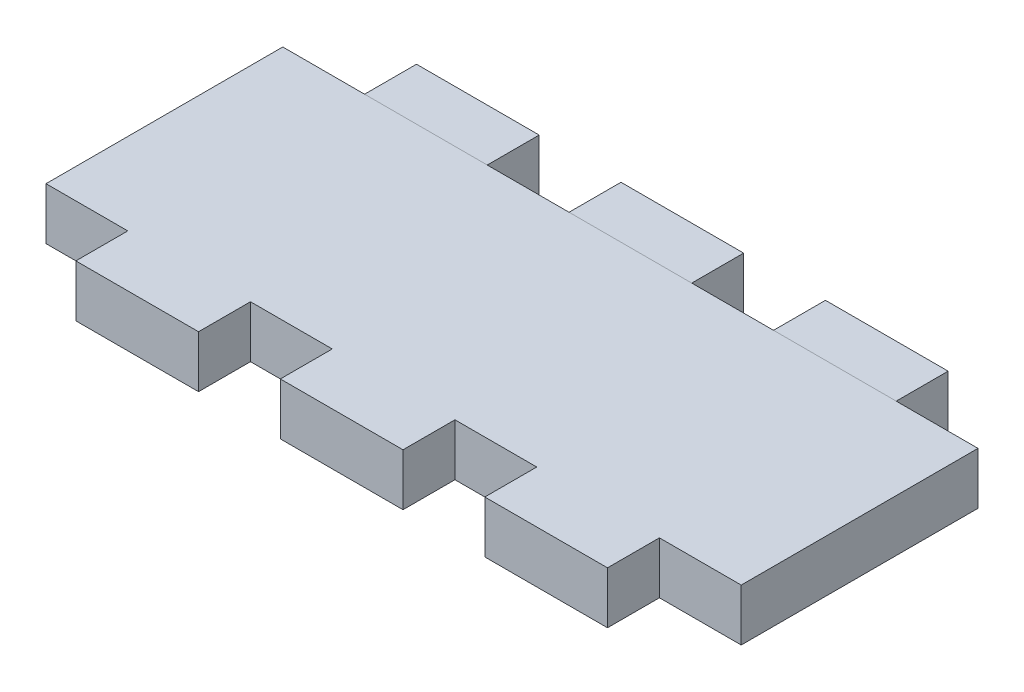
ISO-10303-21;
HEADER;
FILE_DESCRIPTION(('STEP AP214'),'2;1');
FILE_NAME('part.step','',(''),(''),'','','');
FILE_SCHEMA(('AUTOMOTIVE_DESIGN { 1 0 10303 214 1 1 1 1 }'));
ENDSEC;
DATA;
#1=APPLICATION_CONTEXT('core data for automotive mechanical design processes');
#2=APPLICATION_PROTOCOL_DEFINITION('international standard','automotive_design',2000,#1);
#3=PRODUCT_CONTEXT('',#1,'mechanical');
#4=PRODUCT('Part','Part','',(#3));
#5=PRODUCT_RELATED_PRODUCT_CATEGORY('part','',(#4));
#6=PRODUCT_DEFINITION_FORMATION('','',#4);
#7=PRODUCT_DEFINITION_CONTEXT('part definition',#1,'design');
#8=PRODUCT_DEFINITION('design','',#6,#7);
#9=PRODUCT_DEFINITION_SHAPE('','',#8);
#10=(LENGTH_UNIT() NAMED_UNIT(*) SI_UNIT(.MILLI.,.METRE.));
#11=(NAMED_UNIT(*) PLANE_ANGLE_UNIT() SI_UNIT($,.RADIAN.));
#12=(NAMED_UNIT(*) SI_UNIT($,.STERADIAN.) SOLID_ANGLE_UNIT());
#13=UNCERTAINTY_MEASURE_WITH_UNIT(LENGTH_MEASURE(1.E-05),#10,'distance_accuracy_value','');
#14=(GEOMETRIC_REPRESENTATION_CONTEXT(3) GLOBAL_UNCERTAINTY_ASSIGNED_CONTEXT((#13)) GLOBAL_UNIT_ASSIGNED_CONTEXT((#10,
#11,#12)) REPRESENTATION_CONTEXT('',''));
#15=CARTESIAN_POINT('',(0.,0.,0.));
#16=DIRECTION('',(0.,0.,1.));
#17=DIRECTION('',(1.,0.,0.));
#18=AXIS2_PLACEMENT_3D('',#15,#16,#17);
#19=CARTESIAN_POINT('',(17.5,0.,-14.475));
#20=DIRECTION('',(-1.,0.,0.));
#21=DIRECTION('',(0.,0.,1.));
#22=AXIS2_PLACEMENT_3D('',#19,#20,#21);
#23=PLANE('',#22);
#24=DIRECTION('',(0.,0.,1.));
#25=VECTOR('',#24,1.);
#26=CARTESIAN_POINT('',(17.5,6.35,-14.475));
#27=LINE('',#26,#25);
#28=CARTESIAN_POINT('',(17.5,6.35,-20.825));
#29=VERTEX_POINT('',#28);
#30=CARTESIAN_POINT('',(17.5,6.35,-14.475));
#31=VERTEX_POINT('',#30);
#32=EDGE_CURVE('E113',#29,#31,#27,.T.);
#33=ORIENTED_EDGE('',*,*,#32,.F.);
#34=DIRECTION('',(0.,1.,0.));
#35=VECTOR('',#34,1.);
#36=CARTESIAN_POINT('',(17.5,0.,-20.825));
#37=LINE('',#36,#35);
#38=CARTESIAN_POINT('',(17.5,0.,-20.825));
#39=VERTEX_POINT('',#38);
#40=EDGE_CURVE('E12',#39,#29,#37,.T.);
#41=ORIENTED_EDGE('',*,*,#40,.F.);
#42=DIRECTION('',(0.,0.,1.));
#43=VECTOR('',#42,1.);
#44=CARTESIAN_POINT('',(17.5,0.,-14.475));
#45=LINE('',#44,#43);
#46=CARTESIAN_POINT('',(17.5,0.,-14.475));
#47=VERTEX_POINT('',#46);
#48=EDGE_CURVE('E107',#39,#47,#45,.T.);
#49=ORIENTED_EDGE('',*,*,#48,.T.);
#50=DIRECTION('',(0.,1.,0.));
#51=VECTOR('',#50,1.);
#52=CARTESIAN_POINT('',(17.5,0.,-14.475));
#53=LINE('',#52,#51);
#54=EDGE_CURVE('E52',#47,#31,#53,.T.);
#55=ORIENTED_EDGE('',*,*,#54,.T.);
#56=EDGE_LOOP('',(#33,#41,#49,#55));
#57=FACE_BOUND('',#56,.T.);
#58=ADVANCED_FACE('F49',(#57),#23,.T.);
#59=CARTESIAN_POINT('',(17.5,0.,-20.825));
#60=DIRECTION('',(0.,0.,-1.));
#61=DIRECTION('',(-1.,0.,0.));
#62=AXIS2_PLACEMENT_3D('',#59,#60,#61);
#63=PLANE('',#62);
#64=DIRECTION('',(-1.,0.,0.));
#65=VECTOR('',#64,1.);
#66=CARTESIAN_POINT('',(17.5,6.35,-20.825));
#67=LINE('',#66,#65);
#68=CARTESIAN_POINT('',(32.5,6.35,-20.825));
#69=VERTEX_POINT('',#68);
#70=EDGE_CURVE('E109',#69,#29,#67,.T.);
#71=ORIENTED_EDGE('',*,*,#70,.F.);
#72=DIRECTION('',(0.,1.,0.));
#73=VECTOR('',#72,1.);
#74=CARTESIAN_POINT('',(32.5,0.,-20.825));
#75=LINE('',#74,#73);
#76=CARTESIAN_POINT('',(32.5,0.,-20.825));
#77=VERTEX_POINT('',#76);
#78=EDGE_CURVE('E58',#77,#69,#75,.T.);
#79=ORIENTED_EDGE('',*,*,#78,.F.);
#80=DIRECTION('',(-1.,0.,0.));
#81=VECTOR('',#80,1.);
#82=CARTESIAN_POINT('',(17.5,0.,-20.825));
#83=LINE('',#82,#81);
#84=EDGE_CURVE('E104',#77,#39,#83,.T.);
#85=ORIENTED_EDGE('',*,*,#84,.T.);
#86=ORIENTED_EDGE('',*,*,#40,.T.);
#87=EDGE_LOOP('',(#71,#79,#85,#86));
#88=FACE_BOUND('',#87,.T.);
#89=ADVANCED_FACE('F123',(#88),#63,.T.);
#90=CARTESIAN_POINT('',(32.5,0.,-14.475));
#91=DIRECTION('',(1.,0.,0.));
#92=DIRECTION('',(0.,0.,-1.));
#93=AXIS2_PLACEMENT_3D('',#90,#91,#92);
#94=PLANE('',#93);
#95=DIRECTION('',(0.,0.,-1.));
#96=VECTOR('',#95,1.);
#97=CARTESIAN_POINT('',(32.5,6.35,-14.475));
#98=LINE('',#97,#96);
#99=CARTESIAN_POINT('',(32.5,6.35,-14.475));
#100=VERTEX_POINT('',#99);
#101=EDGE_CURVE('E99',#100,#69,#98,.T.);
#102=ORIENTED_EDGE('',*,*,#101,.F.);
#103=DIRECTION('',(0.,1.,0.));
#104=VECTOR('',#103,1.);
#105=CARTESIAN_POINT('',(32.5,0.,-14.475));
#106=LINE('',#105,#104);
#107=CARTESIAN_POINT('',(32.5,0.,-14.475));
#108=VERTEX_POINT('',#107);
#109=EDGE_CURVE('E94',#108,#100,#106,.T.);
#110=ORIENTED_EDGE('',*,*,#109,.F.);
#111=DIRECTION('',(0.,0.,-1.));
#112=VECTOR('',#111,1.);
#113=CARTESIAN_POINT('',(32.5,0.,-14.475));
#114=LINE('',#113,#112);
#115=EDGE_CURVE('E97',#108,#77,#114,.T.);
#116=ORIENTED_EDGE('',*,*,#115,.T.);
#117=ORIENTED_EDGE('',*,*,#78,.T.);
#118=EDGE_LOOP('',(#102,#110,#116,#117));
#119=FACE_BOUND('',#118,.T.);
#120=ADVANCED_FACE('F96',(#119),#94,.T.);
#121=CARTESIAN_POINT('',(17.5,0.,-14.475));
#122=DIRECTION('',(0.,0.,1.));
#123=DIRECTION('',(1.,0.,0.));
#124=AXIS2_PLACEMENT_3D('',#121,#122,#123);
#125=PLANE('',#124);
#126=DIRECTION('',(1.,0.,0.));
#127=VECTOR('',#126,1.);
#128=CARTESIAN_POINT('',(17.5,6.35,-14.475));
#129=LINE('',#128,#127);
#130=EDGE_CURVE('E116',#31,#100,#129,.T.);
#131=ORIENTED_EDGE('',*,*,#130,.F.);
#132=ORIENTED_EDGE('',*,*,#54,.F.);
#133=DIRECTION('',(1.,0.,0.));
#134=VECTOR('',#133,1.);
#135=CARTESIAN_POINT('',(17.5,0.,-14.475));
#136=LINE('',#135,#134);
#137=EDGE_CURVE('E103',#47,#108,#136,.T.);
#138=ORIENTED_EDGE('',*,*,#137,.T.);
#139=ORIENTED_EDGE('',*,*,#109,.T.);
#140=EDGE_LOOP('',(#131,#132,#138,#139));
#141=FACE_BOUND('',#140,.T.);
#142=ADVANCED_FACE('F106',(#141),#125,.T.);
#143=CARTESIAN_POINT('',(0.,0.,0.));
#144=DIRECTION('',(0.,-1.,0.));
#145=DIRECTION('',(0.,0.,-1.));
#146=AXIS2_PLACEMENT_3D('',#143,#144,#145);
#147=PLANE('',#146);
#148=ORIENTED_EDGE('',*,*,#48,.F.);
#149=ORIENTED_EDGE('',*,*,#84,.F.);
#150=ORIENTED_EDGE('',*,*,#115,.F.);
#151=ORIENTED_EDGE('',*,*,#137,.F.);
#152=EDGE_LOOP('',(#148,#149,#150,#151));
#153=FACE_BOUND('',#152,.T.);
#154=ADVANCED_FACE('F102',(#153),#147,.T.);
#155=CARTESIAN_POINT('',(0.,6.35,0.));
#156=DIRECTION('',(0.,-1.,0.));
#157=DIRECTION('',(0.,0.,-1.));
#158=AXIS2_PLACEMENT_3D('',#155,#156,#157);
#159=PLANE('',#158);
#160=ORIENTED_EDGE('',*,*,#32,.T.);
#161=ORIENTED_EDGE('',*,*,#130,.T.);
#162=ORIENTED_EDGE('',*,*,#101,.T.);
#163=ORIENTED_EDGE('',*,*,#70,.T.);
#164=EDGE_LOOP('',(#160,#161,#162,#163));
#165=FACE_BOUND('',#164,.T.);
#166=ADVANCED_FACE('F122',(#165),#159,.F.);
#167=CLOSED_SHELL('',(#58,#89,#120,#142,#154,#166));
#168=MANIFOLD_SOLID_BREP('B2',#167);
#169=CARTESIAN_POINT('',(-7.5,0.,-14.475));
#170=DIRECTION('',(-1.,0.,0.));
#171=DIRECTION('',(0.,0.,1.));
#172=AXIS2_PLACEMENT_3D('',#169,#170,#171);
#173=PLANE('',#172);
#174=DIRECTION('',(0.,0.,1.));
#175=VECTOR('',#174,1.);
#176=CARTESIAN_POINT('',(-7.5,6.35,-14.475));
#177=LINE('',#176,#175);
#178=CARTESIAN_POINT('',(-7.5,6.35,-20.825));
#179=VERTEX_POINT('',#178);
#180=CARTESIAN_POINT('',(-7.5,6.35,-14.475));
#181=VERTEX_POINT('',#180);
#182=EDGE_CURVE('E246',#179,#181,#177,.T.);
#183=ORIENTED_EDGE('',*,*,#182,.F.);
#184=DIRECTION('',(0.,1.,0.));
#185=VECTOR('',#184,1.);
#186=CARTESIAN_POINT('',(-7.5,0.,-20.825));
#187=LINE('',#186,#185);
#188=CARTESIAN_POINT('',(-7.5,0.,-20.825));
#189=VERTEX_POINT('',#188);
#190=EDGE_CURVE('E47',#189,#179,#187,.T.);
#191=ORIENTED_EDGE('',*,*,#190,.F.);
#192=DIRECTION('',(0.,0.,1.));
#193=VECTOR('',#192,1.);
#194=CARTESIAN_POINT('',(-7.5,0.,-14.475));
#195=LINE('',#194,#193);
#196=CARTESIAN_POINT('',(-7.5,0.,-14.475));
#197=VERTEX_POINT('',#196);
#198=EDGE_CURVE('E240',#189,#197,#195,.T.);
#199=ORIENTED_EDGE('',*,*,#198,.T.);
#200=DIRECTION('',(0.,1.,0.));
#201=VECTOR('',#200,1.);
#202=CARTESIAN_POINT('',(-7.5,0.,-14.475));
#203=LINE('',#202,#201);
#204=EDGE_CURVE('E185',#197,#181,#203,.T.);
#205=ORIENTED_EDGE('',*,*,#204,.T.);
#206=EDGE_LOOP('',(#183,#191,#199,#205));
#207=FACE_BOUND('',#206,.T.);
#208=ADVANCED_FACE('F182',(#207),#173,.T.);
#209=CARTESIAN_POINT('',(-7.5,0.,-20.825));
#210=DIRECTION('',(0.,0.,-1.));
#211=DIRECTION('',(-1.,0.,0.));
#212=AXIS2_PLACEMENT_3D('',#209,#210,#211);
#213=PLANE('',#212);
#214=DIRECTION('',(-1.,0.,0.));
#215=VECTOR('',#214,1.);
#216=CARTESIAN_POINT('',(-7.5,6.35,-20.825));
#217=LINE('',#216,#215);
#218=CARTESIAN_POINT('',(7.5,6.35,-20.825));
#219=VERTEX_POINT('',#218);
#220=EDGE_CURVE('E242',#219,#179,#217,.T.);
#221=ORIENTED_EDGE('',*,*,#220,.F.);
#222=DIRECTION('',(0.,1.,0.));
#223=VECTOR('',#222,1.);
#224=CARTESIAN_POINT('',(7.5,0.,-20.825));
#225=LINE('',#224,#223);
#226=CARTESIAN_POINT('',(7.5,0.,-20.825));
#227=VERTEX_POINT('',#226);
#228=EDGE_CURVE('E191',#227,#219,#225,.T.);
#229=ORIENTED_EDGE('',*,*,#228,.F.);
#230=DIRECTION('',(-1.,0.,0.));
#231=VECTOR('',#230,1.);
#232=CARTESIAN_POINT('',(-7.5,0.,-20.825));
#233=LINE('',#232,#231);
#234=EDGE_CURVE('E237',#227,#189,#233,.T.);
#235=ORIENTED_EDGE('',*,*,#234,.T.);
#236=ORIENTED_EDGE('',*,*,#190,.T.);
#237=EDGE_LOOP('',(#221,#229,#235,#236));
#238=FACE_BOUND('',#237,.T.);
#239=ADVANCED_FACE('F256',(#238),#213,.T.);
#240=CARTESIAN_POINT('',(7.5,0.,-14.475));
#241=DIRECTION('',(1.,0.,0.));
#242=DIRECTION('',(0.,0.,-1.));
#243=AXIS2_PLACEMENT_3D('',#240,#241,#242);
#244=PLANE('',#243);
#245=DIRECTION('',(0.,0.,-1.));
#246=VECTOR('',#245,1.);
#247=CARTESIAN_POINT('',(7.5,6.35,-14.475));
#248=LINE('',#247,#246);
#249=CARTESIAN_POINT('',(7.5,6.35,-14.475));
#250=VERTEX_POINT('',#249);
#251=EDGE_CURVE('E232',#250,#219,#248,.T.);
#252=ORIENTED_EDGE('',*,*,#251,.F.);
#253=DIRECTION('',(0.,1.,0.));
#254=VECTOR('',#253,1.);
#255=CARTESIAN_POINT('',(7.5,0.,-14.475));
#256=LINE('',#255,#254);
#257=CARTESIAN_POINT('',(7.5,0.,-14.475));
#258=VERTEX_POINT('',#257);
#259=EDGE_CURVE('E227',#258,#250,#256,.T.);
#260=ORIENTED_EDGE('',*,*,#259,.F.);
#261=DIRECTION('',(0.,0.,-1.));
#262=VECTOR('',#261,1.);
#263=CARTESIAN_POINT('',(7.5,0.,-14.475));
#264=LINE('',#263,#262);
#265=EDGE_CURVE('E230',#258,#227,#264,.T.);
#266=ORIENTED_EDGE('',*,*,#265,.T.);
#267=ORIENTED_EDGE('',*,*,#228,.T.);
#268=EDGE_LOOP('',(#252,#260,#266,#267));
#269=FACE_BOUND('',#268,.T.);
#270=ADVANCED_FACE('F229',(#269),#244,.T.);
#271=CARTESIAN_POINT('',(-7.5,0.,-14.475));
#272=DIRECTION('',(0.,0.,1.));
#273=DIRECTION('',(1.,0.,0.));
#274=AXIS2_PLACEMENT_3D('',#271,#272,#273);
#275=PLANE('',#274);
#276=DIRECTION('',(1.,0.,0.));
#277=VECTOR('',#276,1.);
#278=CARTESIAN_POINT('',(-7.5,6.35,-14.475));
#279=LINE('',#278,#277);
#280=EDGE_CURVE('E249',#181,#250,#279,.T.);
#281=ORIENTED_EDGE('',*,*,#280,.F.);
#282=ORIENTED_EDGE('',*,*,#204,.F.);
#283=DIRECTION('',(1.,0.,0.));
#284=VECTOR('',#283,1.);
#285=CARTESIAN_POINT('',(-7.5,0.,-14.475));
#286=LINE('',#285,#284);
#287=EDGE_CURVE('E236',#197,#258,#286,.T.);
#288=ORIENTED_EDGE('',*,*,#287,.T.);
#289=ORIENTED_EDGE('',*,*,#259,.T.);
#290=EDGE_LOOP('',(#281,#282,#288,#289));
#291=FACE_BOUND('',#290,.T.);
#292=ADVANCED_FACE('F239',(#291),#275,.T.);
#293=CARTESIAN_POINT('',(0.,0.,0.));
#294=DIRECTION('',(0.,-1.,0.));
#295=DIRECTION('',(0.,0.,-1.));
#296=AXIS2_PLACEMENT_3D('',#293,#294,#295);
#297=PLANE('',#296);
#298=ORIENTED_EDGE('',*,*,#198,.F.);
#299=ORIENTED_EDGE('',*,*,#234,.F.);
#300=ORIENTED_EDGE('',*,*,#265,.F.);
#301=ORIENTED_EDGE('',*,*,#287,.F.);
#302=EDGE_LOOP('',(#298,#299,#300,#301));
#303=FACE_BOUND('',#302,.T.);
#304=ADVANCED_FACE('F235',(#303),#297,.T.);
#305=CARTESIAN_POINT('',(0.,6.35,0.));
#306=DIRECTION('',(0.,-1.,0.));
#307=DIRECTION('',(0.,0.,-1.));
#308=AXIS2_PLACEMENT_3D('',#305,#306,#307);
#309=PLANE('',#308);
#310=ORIENTED_EDGE('',*,*,#182,.T.);
#311=ORIENTED_EDGE('',*,*,#280,.T.);
#312=ORIENTED_EDGE('',*,*,#251,.T.);
#313=ORIENTED_EDGE('',*,*,#220,.T.);
#314=EDGE_LOOP('',(#310,#311,#312,#313));
#315=FACE_BOUND('',#314,.T.);
#316=ADVANCED_FACE('F255',(#315),#309,.F.);
#317=CLOSED_SHELL('',(#208,#239,#270,#292,#304,#316));
#318=MANIFOLD_SOLID_BREP('B6',#317);
#319=CARTESIAN_POINT('',(-32.5,0.,-14.475));
#320=DIRECTION('',(-1.,0.,0.));
#321=DIRECTION('',(0.,0.,1.));
#322=AXIS2_PLACEMENT_3D('',#319,#320,#321);
#323=PLANE('',#322);
#324=DIRECTION('',(0.,0.,1.));
#325=VECTOR('',#324,1.);
#326=CARTESIAN_POINT('',(-32.5,6.35,-14.475));
#327=LINE('',#326,#325);
#328=CARTESIAN_POINT('',(-32.5,6.35,-20.825));
#329=VERTEX_POINT('',#328);
#330=CARTESIAN_POINT('',(-32.5,6.35,-14.475));
#331=VERTEX_POINT('',#330);
#332=EDGE_CURVE('E378',#329,#331,#327,.T.);
#333=ORIENTED_EDGE('',*,*,#332,.F.);
#334=DIRECTION('',(0.,1.,0.));
#335=VECTOR('',#334,1.);
#336=CARTESIAN_POINT('',(-32.5,0.,-20.825));
#337=LINE('',#336,#335);
#338=CARTESIAN_POINT('',(-32.5,0.,-20.825));
#339=VERTEX_POINT('',#338);
#340=EDGE_CURVE('E180',#339,#329,#337,.T.);
#341=ORIENTED_EDGE('',*,*,#340,.F.);
#342=DIRECTION('',(0.,0.,1.));
#343=VECTOR('',#342,1.);
#344=CARTESIAN_POINT('',(-32.5,0.,-14.475));
#345=LINE('',#344,#343);
#346=CARTESIAN_POINT('',(-32.5,0.,-14.475));
#347=VERTEX_POINT('',#346);
#348=EDGE_CURVE('E372',#339,#347,#345,.T.);
#349=ORIENTED_EDGE('',*,*,#348,.T.);
#350=DIRECTION('',(0.,1.,0.));
#351=VECTOR('',#350,1.);
#352=CARTESIAN_POINT('',(-32.5,0.,-14.475));
#353=LINE('',#352,#351);
#354=EDGE_CURVE('E317',#347,#331,#353,.T.);
#355=ORIENTED_EDGE('',*,*,#354,.T.);
#356=EDGE_LOOP('',(#333,#341,#349,#355));
#357=FACE_BOUND('',#356,.T.);
#358=ADVANCED_FACE('F314',(#357),#323,.T.);
#359=CARTESIAN_POINT('',(-32.5,0.,-20.825));
#360=DIRECTION('',(0.,0.,-1.));
#361=DIRECTION('',(-1.,0.,0.));
#362=AXIS2_PLACEMENT_3D('',#359,#360,#361);
#363=PLANE('',#362);
#364=DIRECTION('',(-1.,0.,0.));
#365=VECTOR('',#364,1.);
#366=CARTESIAN_POINT('',(-32.5,6.35,-20.825));
#367=LINE('',#366,#365);
#368=CARTESIAN_POINT('',(-17.5,6.35,-20.825));
#369=VERTEX_POINT('',#368);
#370=EDGE_CURVE('E374',#369,#329,#367,.T.);
#371=ORIENTED_EDGE('',*,*,#370,.F.);
#372=DIRECTION('',(0.,1.,0.));
#373=VECTOR('',#372,1.);
#374=CARTESIAN_POINT('',(-17.5,0.,-20.825));
#375=LINE('',#374,#373);
#376=CARTESIAN_POINT('',(-17.5,0.,-20.825));
#377=VERTEX_POINT('',#376);
#378=EDGE_CURVE('E323',#377,#369,#375,.T.);
#379=ORIENTED_EDGE('',*,*,#378,.F.);
#380=DIRECTION('',(-1.,0.,0.));
#381=VECTOR('',#380,1.);
#382=CARTESIAN_POINT('',(-32.5,0.,-20.825));
#383=LINE('',#382,#381);
#384=EDGE_CURVE('E369',#377,#339,#383,.T.);
#385=ORIENTED_EDGE('',*,*,#384,.T.);
#386=ORIENTED_EDGE('',*,*,#340,.T.);
#387=EDGE_LOOP('',(#371,#379,#385,#386));
#388=FACE_BOUND('',#387,.T.);
#389=ADVANCED_FACE('F388',(#388),#363,.T.);
#390=CARTESIAN_POINT('',(-17.5,0.,-14.475));
#391=DIRECTION('',(1.,0.,0.));
#392=DIRECTION('',(0.,0.,-1.));
#393=AXIS2_PLACEMENT_3D('',#390,#391,#392);
#394=PLANE('',#393);
#395=DIRECTION('',(0.,0.,-1.));
#396=VECTOR('',#395,1.);
#397=CARTESIAN_POINT('',(-17.5,6.35,-14.475));
#398=LINE('',#397,#396);
#399=CARTESIAN_POINT('',(-17.5,6.35,-14.475));
#400=VERTEX_POINT('',#399);
#401=EDGE_CURVE('E364',#400,#369,#398,.T.);
#402=ORIENTED_EDGE('',*,*,#401,.F.);
#403=DIRECTION('',(0.,1.,0.));
#404=VECTOR('',#403,1.);
#405=CARTESIAN_POINT('',(-17.5,0.,-14.475));
#406=LINE('',#405,#404);
#407=CARTESIAN_POINT('',(-17.5,0.,-14.475));
#408=VERTEX_POINT('',#407);
#409=EDGE_CURVE('E359',#408,#400,#406,.T.);
#410=ORIENTED_EDGE('',*,*,#409,.F.);
#411=DIRECTION('',(0.,0.,-1.));
#412=VECTOR('',#411,1.);
#413=CARTESIAN_POINT('',(-17.5,0.,-14.475));
#414=LINE('',#413,#412);
#415=EDGE_CURVE('E362',#408,#377,#414,.T.);
#416=ORIENTED_EDGE('',*,*,#415,.T.);
#417=ORIENTED_EDGE('',*,*,#378,.T.);
#418=EDGE_LOOP('',(#402,#410,#416,#417));
#419=FACE_BOUND('',#418,.T.);
#420=ADVANCED_FACE('F361',(#419),#394,.T.);
#421=CARTESIAN_POINT('',(-32.5,0.,-14.475));
#422=DIRECTION('',(0.,0.,1.));
#423=DIRECTION('',(1.,0.,0.));
#424=AXIS2_PLACEMENT_3D('',#421,#422,#423);
#425=PLANE('',#424);
#426=DIRECTION('',(1.,0.,0.));
#427=VECTOR('',#426,1.);
#428=CARTESIAN_POINT('',(-32.5,6.35,-14.475));
#429=LINE('',#428,#427);
#430=EDGE_CURVE('E381',#331,#400,#429,.T.);
#431=ORIENTED_EDGE('',*,*,#430,.F.);
#432=ORIENTED_EDGE('',*,*,#354,.F.);
#433=DIRECTION('',(1.,0.,0.));
#434=VECTOR('',#433,1.);
#435=CARTESIAN_POINT('',(-32.5,0.,-14.475));
#436=LINE('',#435,#434);
#437=EDGE_CURVE('E368',#347,#408,#436,.T.);
#438=ORIENTED_EDGE('',*,*,#437,.T.);
#439=ORIENTED_EDGE('',*,*,#409,.T.);
#440=EDGE_LOOP('',(#431,#432,#438,#439));
#441=FACE_BOUND('',#440,.T.);
#442=ADVANCED_FACE('F371',(#441),#425,.T.);
#443=CARTESIAN_POINT('',(0.,0.,0.));
#444=DIRECTION('',(0.,-1.,0.));
#445=DIRECTION('',(0.,0.,-1.));
#446=AXIS2_PLACEMENT_3D('',#443,#444,#445);
#447=PLANE('',#446);
#448=ORIENTED_EDGE('',*,*,#348,.F.);
#449=ORIENTED_EDGE('',*,*,#384,.F.);
#450=ORIENTED_EDGE('',*,*,#415,.F.);
#451=ORIENTED_EDGE('',*,*,#437,.F.);
#452=EDGE_LOOP('',(#448,#449,#450,#451));
#453=FACE_BOUND('',#452,.T.);
#454=ADVANCED_FACE('F367',(#453),#447,.T.);
#455=CARTESIAN_POINT('',(0.,6.35,0.));
#456=DIRECTION('',(0.,-1.,0.));
#457=DIRECTION('',(0.,0.,-1.));
#458=AXIS2_PLACEMENT_3D('',#455,#456,#457);
#459=PLANE('',#458);
#460=ORIENTED_EDGE('',*,*,#332,.T.);
#461=ORIENTED_EDGE('',*,*,#430,.T.);
#462=ORIENTED_EDGE('',*,*,#401,.T.);
#463=ORIENTED_EDGE('',*,*,#370,.T.);
#464=EDGE_LOOP('',(#460,#461,#462,#463));
#465=FACE_BOUND('',#464,.T.);
#466=ADVANCED_FACE('F387',(#465),#459,.F.);
#467=CLOSED_SHELL('',(#358,#389,#420,#442,#454,#466));
#468=MANIFOLD_SOLID_BREP('B41',#467);
#469=CARTESIAN_POINT('',(-42.5,6.35,14.475));
#470=DIRECTION('',(0.,0.,-1.));
#471=DIRECTION('',(-1.,0.,0.));
#472=AXIS2_PLACEMENT_3D('',#469,#470,#471);
#473=PLANE('',#472);
#474=DIRECTION('',(1.,0.,0.));
#475=VECTOR('',#474,1.);
#476=CARTESIAN_POINT('',(-42.5,0.,14.475));
#477=LINE('',#476,#475);
#478=CARTESIAN_POINT('',(7.5,0.,14.475));
#479=VERTEX_POINT('',#478);
#480=CARTESIAN_POINT('',(17.5,0.,14.475));
#481=VERTEX_POINT('',#480);
#482=EDGE_CURVE('E730',#479,#481,#477,.T.);
#483=ORIENTED_EDGE('',*,*,#482,.T.);
#484=DIRECTION('',(0.,1.,0.));
#485=VECTOR('',#484,1.);
#486=CARTESIAN_POINT('',(17.5,0.,14.475));
#487=LINE('',#486,#485);
#488=CARTESIAN_POINT('',(17.5,6.35,14.475));
#489=VERTEX_POINT('',#488);
#490=EDGE_CURVE('E461',#481,#489,#487,.T.);
#491=ORIENTED_EDGE('',*,*,#490,.T.);
#492=DIRECTION('',(1.,0.,0.));
#493=VECTOR('',#492,1.);
#494=CARTESIAN_POINT('',(-42.5,6.35,14.475));
#495=LINE('',#494,#493);
#496=CARTESIAN_POINT('',(7.5,6.35,14.475));
#497=VERTEX_POINT('',#496);
#498=EDGE_CURVE('E577',#497,#489,#495,.T.);
#499=ORIENTED_EDGE('',*,*,#498,.F.);
#500=DIRECTION('',(0.,1.,0.));
#501=VECTOR('',#500,1.);
#502=CARTESIAN_POINT('',(7.5,0.,14.475));
#503=LINE('',#502,#501);
#504=EDGE_CURVE('E627',#479,#497,#503,.T.);
#505=ORIENTED_EDGE('',*,*,#504,.F.);
#506=EDGE_LOOP('',(#483,#491,#499,#505));
#507=FACE_BOUND('',#506,.T.);
#508=ADVANCED_FACE('F437',(#507),#473,.F.);
#509=CARTESIAN_POINT('',(-17.5,0.,14.475));
#510=VERTEX_POINT('',#509);
#511=CARTESIAN_POINT('',(-7.5,0.,14.475));
#512=VERTEX_POINT('',#511);
#513=EDGE_CURVE('E697',#510,#512,#477,.T.);
#514=ORIENTED_EDGE('',*,*,#513,.T.);
#515=DIRECTION('',(0.,1.,0.));
#516=VECTOR('',#515,1.);
#517=CARTESIAN_POINT('',(-7.5,0.,14.475));
#518=LINE('',#517,#516);
#519=CARTESIAN_POINT('',(-7.5,6.35,14.475));
#520=VERTEX_POINT('',#519);
#521=EDGE_CURVE('E611',#512,#520,#518,.T.);
#522=ORIENTED_EDGE('',*,*,#521,.T.);
#523=CARTESIAN_POINT('',(-17.5,6.35,14.475));
#524=VERTEX_POINT('',#523);
#525=EDGE_CURVE('E683',#524,#520,#495,.T.);
#526=ORIENTED_EDGE('',*,*,#525,.F.);
#527=DIRECTION('',(0.,1.,0.));
#528=VECTOR('',#527,1.);
#529=CARTESIAN_POINT('',(-17.5,0.,14.475));
#530=LINE('',#529,#528);
#531=EDGE_CURVE('E661',#510,#524,#530,.T.);
#532=ORIENTED_EDGE('',*,*,#531,.F.);
#533=EDGE_LOOP('',(#514,#522,#526,#532));
#534=FACE_BOUND('',#533,.T.);
#535=ADVANCED_FACE('F754',(#534),#473,.F.);
#536=CARTESIAN_POINT('',(32.5,6.35,14.475));
#537=VERTEX_POINT('',#536);
#538=CARTESIAN_POINT('',(42.5,6.35,14.475));
#539=VERTEX_POINT('',#538);
#540=EDGE_CURVE('E453',#537,#539,#495,.T.);
#541=ORIENTED_EDGE('',*,*,#540,.F.);
#542=DIRECTION('',(0.,1.,0.));
#543=VECTOR('',#542,1.);
#544=CARTESIAN_POINT('',(32.5,0.,14.475));
#545=LINE('',#544,#543);
#546=CARTESIAN_POINT('',(32.5,0.,14.475));
#547=VERTEX_POINT('',#546);
#548=EDGE_CURVE('E593',#547,#537,#545,.T.);
#549=ORIENTED_EDGE('',*,*,#548,.F.);
#550=CARTESIAN_POINT('',(42.5,0.,14.475));
#551=VERTEX_POINT('',#550);
#552=EDGE_CURVE('E693',#547,#551,#477,.T.);
#553=ORIENTED_EDGE('',*,*,#552,.T.);
#554=DIRECTION('',(0.,-1.,0.));
#555=VECTOR('',#554,1.);
#556=CARTESIAN_POINT('',(42.5,6.35,14.475));
#557=LINE('',#556,#555);
#558=EDGE_CURVE('E682',#539,#551,#557,.T.);
#559=ORIENTED_EDGE('',*,*,#558,.F.);
#560=EDGE_LOOP('',(#541,#549,#553,#559));
#561=FACE_BOUND('',#560,.T.);
#562=ADVANCED_FACE('F731',(#561),#473,.F.);
#563=CARTESIAN_POINT('',(42.5,6.35,14.475));
#564=DIRECTION('',(-1.,0.,0.));
#565=DIRECTION('',(0.,0.,1.));
#566=AXIS2_PLACEMENT_3D('',#563,#564,#565);
#567=PLANE('',#566);
#568=DIRECTION('',(0.,0.,-1.));
#569=VECTOR('',#568,1.);
#570=CARTESIAN_POINT('',(42.5,0.,14.475));
#571=LINE('',#570,#569);
#572=CARTESIAN_POINT('',(42.5,0.,-14.475));
#573=VERTEX_POINT('',#572);
#574=EDGE_CURVE('E667',#551,#573,#571,.T.);
#575=ORIENTED_EDGE('',*,*,#574,.T.);
#576=DIRECTION('',(0.,-1.,0.));
#577=VECTOR('',#576,1.);
#578=CARTESIAN_POINT('',(42.5,6.35,-14.475));
#579=LINE('',#578,#577);
#580=CARTESIAN_POINT('',(42.5,6.35,-14.475));
#581=VERTEX_POINT('',#580);
#582=EDGE_CURVE('E312',#581,#573,#579,.T.);
#583=ORIENTED_EDGE('',*,*,#582,.F.);
#584=DIRECTION('',(0.,0.,-1.));
#585=VECTOR('',#584,1.);
#586=CARTESIAN_POINT('',(42.5,6.35,14.475));
#587=LINE('',#586,#585);
#588=EDGE_CURVE('E668',#539,#581,#587,.T.);
#589=ORIENTED_EDGE('',*,*,#588,.F.);
#590=ORIENTED_EDGE('',*,*,#558,.T.);
#591=EDGE_LOOP('',(#575,#583,#589,#590));
#592=FACE_BOUND('',#591,.T.);
#593=ADVANCED_FACE('F439',(#592),#567,.F.);
#594=CARTESIAN_POINT('',(-42.5,6.35,-14.475));
#595=DIRECTION('',(0.,0.,1.));
#596=DIRECTION('',(1.,0.,0.));
#597=AXIS2_PLACEMENT_3D('',#594,#595,#596);
#598=PLANE('',#597);
#599=DIRECTION('',(-1.,0.,0.));
#600=VECTOR('',#599,1.);
#601=CARTESIAN_POINT('',(-42.5,0.,-14.475));
#602=LINE('',#601,#600);
#603=CARTESIAN_POINT('',(-42.5,0.,-14.475));
#604=VERTEX_POINT('',#603);
#605=EDGE_CURVE('E687',#573,#604,#602,.T.);
#606=ORIENTED_EDGE('',*,*,#605,.T.);
#607=DIRECTION('',(0.,-1.,0.));
#608=VECTOR('',#607,1.);
#609=CARTESIAN_POINT('',(-42.5,6.35,-14.475));
#610=LINE('',#609,#608);
#611=CARTESIAN_POINT('',(-42.5,6.35,-14.475));
#612=VERTEX_POINT('',#611);
#613=EDGE_CURVE('E446',#612,#604,#610,.T.);
#614=ORIENTED_EDGE('',*,*,#613,.F.);
#615=DIRECTION('',(-1.,0.,0.));
#616=VECTOR('',#615,1.);
#617=CARTESIAN_POINT('',(-42.5,6.35,-14.475));
#618=LINE('',#617,#616);
#619=EDGE_CURVE('E671',#581,#612,#618,.T.);
#620=ORIENTED_EDGE('',*,*,#619,.F.);
#621=ORIENTED_EDGE('',*,*,#582,.T.);
#622=EDGE_LOOP('',(#606,#614,#620,#621));
#623=FACE_BOUND('',#622,.T.);
#624=ADVANCED_FACE('F726',(#623),#598,.F.);
#625=CARTESIAN_POINT('',(-42.5,6.35,14.475));
#626=DIRECTION('',(1.,0.,0.));
#627=DIRECTION('',(0.,0.,-1.));
#628=AXIS2_PLACEMENT_3D('',#625,#626,#627);
#629=PLANE('',#628);
#630=DIRECTION('',(0.,0.,1.));
#631=VECTOR('',#630,1.);
#632=CARTESIAN_POINT('',(-42.5,0.,14.475));
#633=LINE('',#632,#631);
#634=CARTESIAN_POINT('',(-42.5,0.,14.475));
#635=VERTEX_POINT('',#634);
#636=EDGE_CURVE('E690',#604,#635,#633,.T.);
#637=ORIENTED_EDGE('',*,*,#636,.T.);
#638=DIRECTION('',(0.,-1.,0.));
#639=VECTOR('',#638,1.);
#640=CARTESIAN_POINT('',(-42.5,6.35,14.475));
#641=LINE('',#640,#639);
#642=CARTESIAN_POINT('',(-42.5,6.35,14.475));
#643=VERTEX_POINT('',#642);
#644=EDGE_CURVE('E701',#643,#635,#641,.T.);
#645=ORIENTED_EDGE('',*,*,#644,.F.);
#646=DIRECTION('',(0.,0.,1.));
#647=VECTOR('',#646,1.);
#648=CARTESIAN_POINT('',(-42.5,6.35,14.475));
#649=LINE('',#648,#647);
#650=EDGE_CURVE('E675',#612,#643,#649,.T.);
#651=ORIENTED_EDGE('',*,*,#650,.F.);
#652=ORIENTED_EDGE('',*,*,#613,.T.);
#653=EDGE_LOOP('',(#637,#645,#651,#652));
#654=FACE_BOUND('',#653,.T.);
#655=ADVANCED_FACE('F710',(#654),#629,.F.);
#656=CARTESIAN_POINT('',(-32.5,0.,14.475));
#657=VERTEX_POINT('',#656);
#658=EDGE_CURVE('E672',#635,#657,#477,.T.);
#659=ORIENTED_EDGE('',*,*,#658,.T.);
#660=DIRECTION('',(0.,1.,0.));
#661=VECTOR('',#660,1.);
#662=CARTESIAN_POINT('',(-32.5,0.,14.475));
#663=LINE('',#662,#661);
#664=CARTESIAN_POINT('',(-32.5,6.35,14.475));
#665=VERTEX_POINT('',#664);
#666=EDGE_CURVE('E644',#657,#665,#663,.T.);
#667=ORIENTED_EDGE('',*,*,#666,.T.);
#668=EDGE_CURVE('E678',#643,#665,#495,.T.);
#669=ORIENTED_EDGE('',*,*,#668,.F.);
#670=ORIENTED_EDGE('',*,*,#644,.T.);
#671=EDGE_LOOP('',(#659,#667,#669,#670));
#672=FACE_BOUND('',#671,.T.);
#673=ADVANCED_FACE('F720',(#672),#473,.F.);
#674=CARTESIAN_POINT('',(0.,6.35,0.));
#675=DIRECTION('',(0.,-1.,0.));
#676=DIRECTION('',(0.,0.,-1.));
#677=AXIS2_PLACEMENT_3D('',#674,#675,#676);
#678=PLANE('',#677);
#679=ORIENTED_EDGE('',*,*,#588,.T.);
#680=ORIENTED_EDGE('',*,*,#619,.T.);
#681=ORIENTED_EDGE('',*,*,#650,.T.);
#682=ORIENTED_EDGE('',*,*,#668,.T.);
#683=DIRECTION('',(0.,0.,-1.));
#684=VECTOR('',#683,1.);
#685=CARTESIAN_POINT('',(-32.5,6.35,14.475));
#686=LINE('',#685,#684);
#687=CARTESIAN_POINT('',(-32.5,6.35,20.825));
#688=VERTEX_POINT('',#687);
#689=EDGE_CURVE('E634',#688,#665,#686,.T.);
#690=ORIENTED_EDGE('',*,*,#689,.F.);
#691=DIRECTION('',(-1.,0.,0.));
#692=VECTOR('',#691,1.);
#693=CARTESIAN_POINT('',(-32.5,6.35,20.825));
#694=LINE('',#693,#692);
#695=CARTESIAN_POINT('',(-17.5,6.35,20.825));
#696=VERTEX_POINT('',#695);
#697=EDGE_CURVE('E648',#696,#688,#694,.T.);
#698=ORIENTED_EDGE('',*,*,#697,.F.);
#699=DIRECTION('',(0.,0.,1.));
#700=VECTOR('',#699,1.);
#701=CARTESIAN_POINT('',(-17.5,6.35,14.475));
#702=LINE('',#701,#700);
#703=EDGE_CURVE('E658',#524,#696,#702,.T.);
#704=ORIENTED_EDGE('',*,*,#703,.F.);
#705=ORIENTED_EDGE('',*,*,#525,.T.);
#706=DIRECTION('',(0.,0.,-1.));
#707=VECTOR('',#706,1.);
#708=CARTESIAN_POINT('',(-7.5,6.35,14.475));
#709=LINE('',#708,#707);
#710=CARTESIAN_POINT('',(-7.5,6.35,20.825));
#711=VERTEX_POINT('',#710);
#712=EDGE_CURVE('E599',#711,#520,#709,.T.);
#713=ORIENTED_EDGE('',*,*,#712,.F.);
#714=DIRECTION('',(-1.,0.,0.));
#715=VECTOR('',#714,1.);
#716=CARTESIAN_POINT('',(-7.5,6.35,20.825));
#717=LINE('',#716,#715);
#718=CARTESIAN_POINT('',(7.5,6.35,20.825));
#719=VERTEX_POINT('',#718);
#720=EDGE_CURVE('E614',#719,#711,#717,.T.);
#721=ORIENTED_EDGE('',*,*,#720,.F.);
#722=DIRECTION('',(0.,0.,1.));
#723=VECTOR('',#722,1.);
#724=CARTESIAN_POINT('',(7.5,6.35,14.475));
#725=LINE('',#724,#723);
#726=EDGE_CURVE('E624',#497,#719,#725,.T.);
#727=ORIENTED_EDGE('',*,*,#726,.F.);
#728=ORIENTED_EDGE('',*,*,#498,.T.);
#729=DIRECTION('',(0.,0.,-1.));
#730=VECTOR('',#729,1.);
#731=CARTESIAN_POINT('',(17.5,6.35,14.475));
#732=LINE('',#731,#730);
#733=CARTESIAN_POINT('',(17.5,6.35,20.825));
#734=VERTEX_POINT('',#733);
#735=EDGE_CURVE('E569',#734,#489,#732,.T.);
#736=ORIENTED_EDGE('',*,*,#735,.F.);
#737=DIRECTION('',(-1.,0.,0.));
#738=VECTOR('',#737,1.);
#739=CARTESIAN_POINT('',(17.5,6.35,20.825));
#740=LINE('',#739,#738);
#741=CARTESIAN_POINT('',(32.5,6.35,20.825));
#742=VERTEX_POINT('',#741);
#743=EDGE_CURVE('E553',#742,#734,#740,.T.);
#744=ORIENTED_EDGE('',*,*,#743,.F.);
#745=DIRECTION('',(0.,0.,1.));
#746=VECTOR('',#745,1.);
#747=CARTESIAN_POINT('',(32.5,6.35,14.475));
#748=LINE('',#747,#746);
#749=EDGE_CURVE('E590',#537,#742,#748,.T.);
#750=ORIENTED_EDGE('',*,*,#749,.F.);
#751=ORIENTED_EDGE('',*,*,#540,.T.);
#752=EDGE_LOOP('',(#679,#680,#681,#682,#690,#698,#704,#705,#713,#721,#727,#728,#736,#744,#750,#751));
#753=FACE_BOUND('',#752,.T.);
#754=ADVANCED_FACE('F575',(#753),#678,.F.);
#755=CARTESIAN_POINT('',(0.,0.,0.));
#756=DIRECTION('',(0.,-1.,0.));
#757=DIRECTION('',(0.,0.,-1.));
#758=AXIS2_PLACEMENT_3D('',#755,#756,#757);
#759=PLANE('',#758);
#760=ORIENTED_EDGE('',*,*,#574,.F.);
#761=ORIENTED_EDGE('',*,*,#552,.F.);
#762=DIRECTION('',(0.,0.,1.));
#763=VECTOR('',#762,1.);
#764=CARTESIAN_POINT('',(32.5,0.,14.475));
#765=LINE('',#764,#763);
#766=CARTESIAN_POINT('',(32.5,0.,20.825));
#767=VERTEX_POINT('',#766);
#768=EDGE_CURVE('E596',#547,#767,#765,.T.);
#769=ORIENTED_EDGE('',*,*,#768,.T.);
#770=DIRECTION('',(-1.,0.,0.));
#771=VECTOR('',#770,1.);
#772=CARTESIAN_POINT('',(17.5,0.,20.825));
#773=LINE('',#772,#771);
#774=CARTESIAN_POINT('',(17.5,0.,20.825));
#775=VERTEX_POINT('',#774);
#776=EDGE_CURVE('E587',#767,#775,#773,.T.);
#777=ORIENTED_EDGE('',*,*,#776,.T.);
#778=DIRECTION('',(0.,0.,-1.));
#779=VECTOR('',#778,1.);
#780=CARTESIAN_POINT('',(17.5,0.,14.475));
#781=LINE('',#780,#779);
#782=EDGE_CURVE('E571',#775,#481,#781,.T.);
#783=ORIENTED_EDGE('',*,*,#782,.T.);
#784=ORIENTED_EDGE('',*,*,#482,.F.);
#785=DIRECTION('',(0.,0.,1.));
#786=VECTOR('',#785,1.);
#787=CARTESIAN_POINT('',(7.5,0.,14.475));
#788=LINE('',#787,#786);
#789=CARTESIAN_POINT('',(7.5,0.,20.825));
#790=VERTEX_POINT('',#789);
#791=EDGE_CURVE('E631',#479,#790,#788,.T.);
#792=ORIENTED_EDGE('',*,*,#791,.T.);
#793=DIRECTION('',(-1.,0.,0.));
#794=VECTOR('',#793,1.);
#795=CARTESIAN_POINT('',(-7.5,0.,20.825));
#796=LINE('',#795,#794);
#797=CARTESIAN_POINT('',(-7.5,0.,20.825));
#798=VERTEX_POINT('',#797);
#799=EDGE_CURVE('E621',#790,#798,#796,.T.);
#800=ORIENTED_EDGE('',*,*,#799,.T.);
#801=DIRECTION('',(0.,0.,-1.));
#802=VECTOR('',#801,1.);
#803=CARTESIAN_POINT('',(-7.5,0.,14.475));
#804=LINE('',#803,#802);
#805=EDGE_CURVE('E607',#798,#512,#804,.T.);
#806=ORIENTED_EDGE('',*,*,#805,.T.);
#807=ORIENTED_EDGE('',*,*,#513,.F.);
#808=DIRECTION('',(0.,0.,1.));
#809=VECTOR('',#808,1.);
#810=CARTESIAN_POINT('',(-17.5,0.,14.475));
#811=LINE('',#810,#809);
#812=CARTESIAN_POINT('',(-17.5,0.,20.825));
#813=VERTEX_POINT('',#812);
#814=EDGE_CURVE('E664',#510,#813,#811,.T.);
#815=ORIENTED_EDGE('',*,*,#814,.T.);
#816=DIRECTION('',(-1.,0.,0.));
#817=VECTOR('',#816,1.);
#818=CARTESIAN_POINT('',(-32.5,0.,20.825));
#819=LINE('',#818,#817);
#820=CARTESIAN_POINT('',(-32.5,0.,20.825));
#821=VERTEX_POINT('',#820);
#822=EDGE_CURVE('E655',#813,#821,#819,.T.);
#823=ORIENTED_EDGE('',*,*,#822,.T.);
#824=DIRECTION('',(0.,0.,-1.));
#825=VECTOR('',#824,1.);
#826=CARTESIAN_POINT('',(-32.5,0.,14.475));
#827=LINE('',#826,#825);
#828=EDGE_CURVE('E641',#821,#657,#827,.T.);
#829=ORIENTED_EDGE('',*,*,#828,.T.);
#830=ORIENTED_EDGE('',*,*,#658,.F.);
#831=ORIENTED_EDGE('',*,*,#636,.F.);
#832=ORIENTED_EDGE('',*,*,#605,.F.);
#833=EDGE_LOOP('',(#760,#761,#769,#777,#783,#784,#792,#800,#806,#807,#815,#823,#829,#830,#831,#832));
#834=FACE_BOUND('',#833,.T.);
#835=ADVANCED_FACE('F716',(#834),#759,.T.);
#836=CARTESIAN_POINT('',(-32.5,0.,14.475));
#837=DIRECTION('',(-1.,0.,0.));
#838=DIRECTION('',(0.,0.,-1.));
#839=AXIS2_PLACEMENT_3D('',#836,#837,#838);
#840=PLANE('',#839);
#841=ORIENTED_EDGE('',*,*,#689,.T.);
#842=ORIENTED_EDGE('',*,*,#666,.F.);
#843=ORIENTED_EDGE('',*,*,#828,.F.);
#844=DIRECTION('',(0.,1.,0.));
#845=VECTOR('',#844,1.);
#846=CARTESIAN_POINT('',(-32.5,0.,20.825));
#847=LINE('',#846,#845);
#848=EDGE_CURVE('E637',#821,#688,#847,.T.);
#849=ORIENTED_EDGE('',*,*,#848,.T.);
#850=EDGE_LOOP('',(#841,#842,#843,#849));
#851=FACE_BOUND('',#850,.T.);
#852=ADVANCED_FACE('F769',(#851),#840,.T.);
#853=CARTESIAN_POINT('',(-32.5,0.,20.825));
#854=DIRECTION('',(0.,0.,1.));
#855=DIRECTION('',(-1.,0.,0.));
#856=AXIS2_PLACEMENT_3D('',#853,#854,#855);
#857=PLANE('',#856);
#858=ORIENTED_EDGE('',*,*,#697,.T.);
#859=ORIENTED_EDGE('',*,*,#848,.F.);
#860=ORIENTED_EDGE('',*,*,#822,.F.);
#861=DIRECTION('',(0.,1.,0.));
#862=VECTOR('',#861,1.);
#863=CARTESIAN_POINT('',(-17.5,0.,20.825));
#864=LINE('',#863,#862);
#865=EDGE_CURVE('E651',#813,#696,#864,.T.);
#866=ORIENTED_EDGE('',*,*,#865,.T.);
#867=EDGE_LOOP('',(#858,#859,#860,#866));
#868=FACE_BOUND('',#867,.T.);
#869=ADVANCED_FACE('F766',(#868),#857,.T.);
#870=CARTESIAN_POINT('',(-17.5,0.,14.475));
#871=DIRECTION('',(1.,0.,0.));
#872=DIRECTION('',(0.,0.,1.));
#873=AXIS2_PLACEMENT_3D('',#870,#871,#872);
#874=PLANE('',#873);
#875=ORIENTED_EDGE('',*,*,#703,.T.);
#876=ORIENTED_EDGE('',*,*,#865,.F.);
#877=ORIENTED_EDGE('',*,*,#814,.F.);
#878=ORIENTED_EDGE('',*,*,#531,.T.);
#879=EDGE_LOOP('',(#875,#876,#877,#878));
#880=FACE_BOUND('',#879,.T.);
#881=ADVANCED_FACE('F763',(#880),#874,.T.);
#882=CARTESIAN_POINT('',(-7.5,0.,14.475));
#883=DIRECTION('',(-1.,0.,0.));
#884=DIRECTION('',(0.,0.,-1.));
#885=AXIS2_PLACEMENT_3D('',#882,#883,#884);
#886=PLANE('',#885);
#887=ORIENTED_EDGE('',*,*,#712,.T.);
#888=ORIENTED_EDGE('',*,*,#521,.F.);
#889=ORIENTED_EDGE('',*,*,#805,.F.);
#890=DIRECTION('',(0.,1.,0.));
#891=VECTOR('',#890,1.);
#892=CARTESIAN_POINT('',(-7.5,0.,20.825));
#893=LINE('',#892,#891);
#894=EDGE_CURVE('E603',#798,#711,#893,.T.);
#895=ORIENTED_EDGE('',*,*,#894,.T.);
#896=EDGE_LOOP('',(#887,#888,#889,#895));
#897=FACE_BOUND('',#896,.T.);
#898=ADVANCED_FACE('F749',(#897),#886,.T.);
#899=CARTESIAN_POINT('',(-7.5,0.,20.825));
#900=DIRECTION('',(0.,0.,1.));
#901=DIRECTION('',(-1.,0.,0.));
#902=AXIS2_PLACEMENT_3D('',#899,#900,#901);
#903=PLANE('',#902);
#904=ORIENTED_EDGE('',*,*,#720,.T.);
#905=ORIENTED_EDGE('',*,*,#894,.F.);
#906=ORIENTED_EDGE('',*,*,#799,.F.);
#907=DIRECTION('',(0.,1.,0.));
#908=VECTOR('',#907,1.);
#909=CARTESIAN_POINT('',(7.5,0.,20.825));
#910=LINE('',#909,#908);
#911=EDGE_CURVE('E617',#790,#719,#910,.T.);
#912=ORIENTED_EDGE('',*,*,#911,.T.);
#913=EDGE_LOOP('',(#904,#905,#906,#912));
#914=FACE_BOUND('',#913,.T.);
#915=ADVANCED_FACE('F744',(#914),#903,.T.);
#916=CARTESIAN_POINT('',(7.5,0.,14.475));
#917=DIRECTION('',(1.,0.,0.));
#918=DIRECTION('',(0.,0.,1.));
#919=AXIS2_PLACEMENT_3D('',#916,#917,#918);
#920=PLANE('',#919);
#921=ORIENTED_EDGE('',*,*,#726,.T.);
#922=ORIENTED_EDGE('',*,*,#911,.F.);
#923=ORIENTED_EDGE('',*,*,#791,.F.);
#924=ORIENTED_EDGE('',*,*,#504,.T.);
#925=EDGE_LOOP('',(#921,#922,#923,#924));
#926=FACE_BOUND('',#925,.T.);
#927=ADVANCED_FACE('F739',(#926),#920,.T.);
#928=CARTESIAN_POINT('',(17.5,0.,14.475));
#929=DIRECTION('',(-1.,0.,0.));
#930=DIRECTION('',(0.,0.,-1.));
#931=AXIS2_PLACEMENT_3D('',#928,#929,#930);
#932=PLANE('',#931);
#933=ORIENTED_EDGE('',*,*,#735,.T.);
#934=ORIENTED_EDGE('',*,*,#490,.F.);
#935=ORIENTED_EDGE('',*,*,#782,.F.);
#936=DIRECTION('',(0.,1.,0.));
#937=VECTOR('',#936,1.);
#938=CARTESIAN_POINT('',(17.5,0.,20.825));
#939=LINE('',#938,#937);
#940=EDGE_CURVE('E557',#775,#734,#939,.T.);
#941=ORIENTED_EDGE('',*,*,#940,.T.);
#942=EDGE_LOOP('',(#933,#934,#935,#941));
#943=FACE_BOUND('',#942,.T.);
#944=ADVANCED_FACE('F568',(#943),#932,.T.);
#945=CARTESIAN_POINT('',(17.5,0.,20.825));
#946=DIRECTION('',(0.,0.,1.));
#947=DIRECTION('',(-1.,0.,0.));
#948=AXIS2_PLACEMENT_3D('',#945,#946,#947);
#949=PLANE('',#948);
#950=ORIENTED_EDGE('',*,*,#743,.T.);
#951=ORIENTED_EDGE('',*,*,#940,.F.);
#952=ORIENTED_EDGE('',*,*,#776,.F.);
#953=DIRECTION('',(0.,1.,0.));
#954=VECTOR('',#953,1.);
#955=CARTESIAN_POINT('',(32.5,0.,20.825));
#956=LINE('',#955,#954);
#957=EDGE_CURVE('E560',#767,#742,#956,.T.);
#958=ORIENTED_EDGE('',*,*,#957,.T.);
#959=EDGE_LOOP('',(#950,#951,#952,#958));
#960=FACE_BOUND('',#959,.T.);
#961=ADVANCED_FACE('F555',(#960),#949,.T.);
#962=CARTESIAN_POINT('',(32.5,0.,14.475));
#963=DIRECTION('',(1.,0.,0.));
#964=DIRECTION('',(0.,0.,1.));
#965=AXIS2_PLACEMENT_3D('',#962,#963,#964);
#966=PLANE('',#965);
#967=ORIENTED_EDGE('',*,*,#749,.T.);
#968=ORIENTED_EDGE('',*,*,#957,.F.);
#969=ORIENTED_EDGE('',*,*,#768,.F.);
#970=ORIENTED_EDGE('',*,*,#548,.T.);
#971=EDGE_LOOP('',(#967,#968,#969,#970));
#972=FACE_BOUND('',#971,.T.);
#973=ADVANCED_FACE('F733',(#972),#966,.T.);
#974=CLOSED_SHELL('',(#508,#535,#562,#593,#624,#655,#673,#754,#835,#852,#869,#881,#898,#915,
#927,#944,#961,#973));
#975=MANIFOLD_SOLID_BREP('B174',#974);
#976=ADVANCED_BREP_SHAPE_REPRESENTATION('',(#18,#168,#318,#468,#975),#14);
#977=SHAPE_DEFINITION_REPRESENTATION(#9,#976);
ENDSEC;
END-ISO-10303-21;
